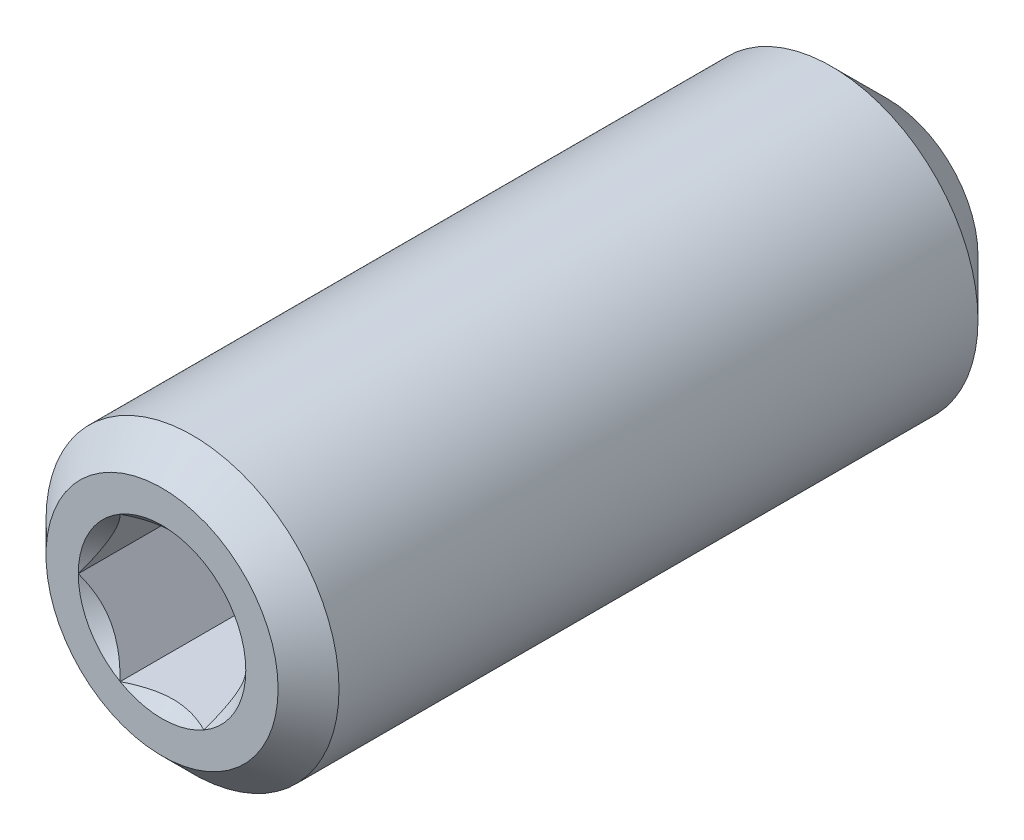
ISO-10303-21;
HEADER;
FILE_DESCRIPTION(('STEP AP214'),'2;1');
FILE_NAME('part.step','',(''),(''),'','','');
FILE_SCHEMA(('AUTOMOTIVE_DESIGN { 1 0 10303 214 1 1 1 1 }'));
ENDSEC;
DATA;
#1=APPLICATION_CONTEXT('core data for automotive mechanical design processes');
#2=APPLICATION_PROTOCOL_DEFINITION('international standard','automotive_design',2000,#1);
#3=PRODUCT_CONTEXT('',#1,'mechanical');
#4=PRODUCT('Part','Part','',(#3));
#5=PRODUCT_RELATED_PRODUCT_CATEGORY('part','',(#4));
#6=PRODUCT_DEFINITION_FORMATION('','',#4);
#7=PRODUCT_DEFINITION_CONTEXT('part definition',#1,'design');
#8=PRODUCT_DEFINITION('design','',#6,#7);
#9=PRODUCT_DEFINITION_SHAPE('','',#8);
#10=(LENGTH_UNIT() NAMED_UNIT(*) SI_UNIT(.MILLI.,.METRE.));
#11=(NAMED_UNIT(*) PLANE_ANGLE_UNIT() SI_UNIT($,.RADIAN.));
#12=(NAMED_UNIT(*) SI_UNIT($,.STERADIAN.) SOLID_ANGLE_UNIT());
#13=UNCERTAINTY_MEASURE_WITH_UNIT(LENGTH_MEASURE(1.E-05),#10,'distance_accuracy_value','');
#14=(GEOMETRIC_REPRESENTATION_CONTEXT(3) GLOBAL_UNCERTAINTY_ASSIGNED_CONTEXT((#13)) GLOBAL_UNIT_ASSIGNED_CONTEXT((#10,
#11,#12)) REPRESENTATION_CONTEXT('',''));
#15=CARTESIAN_POINT('',(0.,0.,0.));
#16=DIRECTION('',(0.,0.,1.));
#17=DIRECTION('',(1.,0.,0.));
#18=AXIS2_PLACEMENT_3D('',#15,#16,#17);
#19=CARTESIAN_POINT('',(0.,0.,-2.065741454089));
#20=DIRECTION('',(0.,0.,-1.));
#21=DIRECTION('',(1.,0.,0.));
#22=AXIS2_PLACEMENT_3D('',#19,#20,#21);
#23=SPHERICAL_SURFACE('',#22,0.57735026919);
#24=CARTESIAN_POINT('',(0.,0.,-2.620441650315));
#25=DIRECTION('',(0.,0.,1.));
#26=DIRECTION('',(1.,0.,0.));
#27=AXIS2_PLACEMENT_3D('',#24,#25,#26);
#28=CIRCLE('',#27,0.160128153805);
#29=CARTESIAN_POINT('',(0.160128153805,0.,-2.620441650315));
#30=VERTEX_POINT('',#29);
#31=EDGE_CURVE('E32',#30,#30,#28,.T.);
#32=ORIENTED_EDGE('',*,*,#31,.T.);
#33=CARTESIAN_POINT('',(0.,0.,-2.065741454089));
#34=DIRECTION('',(0.,1.,0.));
#35=DIRECTION('',(0.277350098112843,0.,-0.960768922830457));
#36=AXIS2_PLACEMENT_3D('',#33,#34,#35);
#37=CIRCLE('',#36,0.57735026919);
#38=CARTESIAN_POINT('',(0.,0.,-2.643091723279));
#39=VERTEX_POINT('',#38);
#40=EDGE_CURVE('E11',#30,#39,#37,.T.);
#41=ORIENTED_EDGE('',*,*,#40,.T.);
#42=ORIENTED_EDGE('',*,*,#40,.F.);
#43=EDGE_LOOP('',(#32,#41,#42));
#44=FACE_BOUND('',#43,.T.);
#45=ADVANCED_FACE('F17',(#44),#23,.F.);
#46=CARTESIAN_POINT('',(0.,0.,-1.333333333333));
#47=DIRECTION('',(0.,0.,1.));
#48=DIRECTION('',(1.,0.,0.));
#49=AXIS2_PLACEMENT_3D('',#46,#47,#48);
#50=CONICAL_SURFACE('',#49,2.309401076759,1.031217286681);
#51=CARTESIAN_POINT('',(1.15470053837881,-2.5685009674703E-13,-2.02483446876319));
#52=CARTESIAN_POINT('',(0.866025403783984,-0.500000000000029,-2.19770975262065));
#53=CARTESIAN_POINT('',(0.577350269189145,-0.99999999999982,-2.02483446876316));
#54=(BOUNDED_CURVE() B_SPLINE_CURVE(2,(#51,#52,#53),.UNSPECIFIED.,.F.,
.F.) B_SPLINE_CURVE_WITH_KNOTS((3,3),(0.,1.),
.UNSPECIFIED.) CURVE() GEOMETRIC_REPRESENTATION_ITEM() RATIONAL_B_SPLINE_CURVE((1.,
1.15470053837926,1.)) REPRESENTATION_ITEM(''));
#55=CARTESIAN_POINT('',(1.154700538379,0.,-2.024834468763));
#56=VERTEX_POINT('',#55);
#57=CARTESIAN_POINT('',(0.57735026919,-1.,-2.024834468763));
#58=VERTEX_POINT('',#57);
#59=EDGE_CURVE('E191',#56,#58,#54,.T.);
#60=ORIENTED_EDGE('',*,*,#59,.F.);
#61=DIRECTION('',(-0.857925035989725,0.,-0.513774885160835));
#62=VECTOR('',#61,1.);
#63=CARTESIAN_POINT('',(2.309401076759,0.,-1.333333333333));
#64=LINE('',#63,#62);
#65=EDGE_CURVE('E274',#56,#30,#64,.T.);
#66=ORIENTED_EDGE('',*,*,#65,.T.);
#67=ORIENTED_EDGE('',*,*,#31,.F.);
#68=ORIENTED_EDGE('',*,*,#65,.F.);
#69=CARTESIAN_POINT('',(0.577350269189689,0.999999999998877,-2.02483446876349));
#70=CARTESIAN_POINT('',(0.866025403784267,0.499999999999538,-2.19770975262057));
#71=CARTESIAN_POINT('',(1.15470053837902,-1.09245945623115E-13,-2.02483446876307));
#72=(BOUNDED_CURVE() B_SPLINE_CURVE(2,(#69,#70,#71),.UNSPECIFIED.,.F.,
.F.) B_SPLINE_CURVE_WITH_KNOTS((3,3),(0.,1.),
.UNSPECIFIED.) CURVE() GEOMETRIC_REPRESENTATION_ITEM() RATIONAL_B_SPLINE_CURVE((1.,
1.1547005383791,1.)) REPRESENTATION_ITEM(''));
#73=CARTESIAN_POINT('',(0.57735026919,1.,-2.024834468763));
#74=VERTEX_POINT('',#73);
#75=EDGE_CURVE('E203',#74,#56,#72,.T.);
#76=ORIENTED_EDGE('',*,*,#75,.F.);
#77=CARTESIAN_POINT('',(-0.577350269189744,1.,-2.02483446876316));
#78=CARTESIAN_POINT('',(1.28230759344206E-13,1.,-2.19770975262071));
#79=CARTESIAN_POINT('',(0.577350269190085,1.,-2.02483446876305));
#80=(BOUNDED_CURVE() B_SPLINE_CURVE(2,(#77,#78,#79),.UNSPECIFIED.,.F.,
.F.) B_SPLINE_CURVE_WITH_KNOTS((3,3),(0.,1.),
.UNSPECIFIED.) CURVE() GEOMETRIC_REPRESENTATION_ITEM() RATIONAL_B_SPLINE_CURVE((1.,
1.15470053837939,1.)) REPRESENTATION_ITEM(''));
#81=CARTESIAN_POINT('',(-0.57735026919,1.,-2.024834468763));
#82=VERTEX_POINT('',#81);
#83=EDGE_CURVE('E339',#82,#74,#80,.T.);
#84=ORIENTED_EDGE('',*,*,#83,.F.);
#85=CARTESIAN_POINT('',(-1.15470053837881,2.5685009674703E-13,-2.02483446876319));
#86=CARTESIAN_POINT('',(-0.866025403783984,0.500000000000029,-2.19770975262065));
#87=CARTESIAN_POINT('',(-0.577350269189145,0.99999999999982,-2.02483446876316));
#88=(BOUNDED_CURVE() B_SPLINE_CURVE(2,(#85,#86,#87),.UNSPECIFIED.,.F.,
.F.) B_SPLINE_CURVE_WITH_KNOTS((3,3),(0.,1.),
.UNSPECIFIED.) CURVE() GEOMETRIC_REPRESENTATION_ITEM() RATIONAL_B_SPLINE_CURVE((1.,
1.15470053837926,1.)) REPRESENTATION_ITEM(''));
#89=CARTESIAN_POINT('',(-1.154700538379,0.,-2.024834468763));
#90=VERTEX_POINT('',#89);
#91=EDGE_CURVE('E329',#90,#82,#88,.T.);
#92=ORIENTED_EDGE('',*,*,#91,.F.);
#93=CARTESIAN_POINT('',(-0.577350269189689,-0.999999999998877,-2.02483446876349));
#94=CARTESIAN_POINT('',(-0.866025403784267,-0.499999999999538,-2.19770975262057));
#95=CARTESIAN_POINT('',(-1.15470053837902,1.09245945623115E-13,-2.02483446876307));
#96=(BOUNDED_CURVE() B_SPLINE_CURVE(2,(#93,#94,#95),.UNSPECIFIED.,.F.,
.F.) B_SPLINE_CURVE_WITH_KNOTS((3,3),(0.,1.),
.UNSPECIFIED.) CURVE() GEOMETRIC_REPRESENTATION_ITEM() RATIONAL_B_SPLINE_CURVE((1.,
1.1547005383791,1.)) REPRESENTATION_ITEM(''));
#97=CARTESIAN_POINT('',(-0.57735026919,-1.,-2.024834468763));
#98=VERTEX_POINT('',#97);
#99=EDGE_CURVE('E180',#98,#90,#96,.T.);
#100=ORIENTED_EDGE('',*,*,#99,.F.);
#101=CARTESIAN_POINT('',(0.577350269189745,-1.,-2.02483446876316));
#102=CARTESIAN_POINT('',(-1.27897692436818E-13,-1.,-2.19770975262071));
#103=CARTESIAN_POINT('',(-0.577350269190086,-1.,-2.02483446876305));
#104=(BOUNDED_CURVE() B_SPLINE_CURVE(2,(#101,#102,#103),.UNSPECIFIED.,.F.,
.F.) B_SPLINE_CURVE_WITH_KNOTS((3,3),(0.,1.),
.UNSPECIFIED.) CURVE() GEOMETRIC_REPRESENTATION_ITEM() RATIONAL_B_SPLINE_CURVE((1.,
1.15470053837939,1.)) REPRESENTATION_ITEM(''));
#105=EDGE_CURVE('E181',#58,#98,#104,.T.);
#106=ORIENTED_EDGE('',*,*,#105,.F.);
#107=EDGE_LOOP('',(#60,#66,#67,#68,#76,#84,#92,#100,#106));
#108=FACE_BOUND('',#107,.T.);
#109=ADVANCED_FACE('F261',(#108),#50,.F.);
#110=CARTESIAN_POINT('',(0.,0.,-10.));
#111=DIRECTION('',(0.,0.,1.));
#112=DIRECTION('',(1.,0.,0.));
#113=AXIS2_PLACEMENT_3D('',#110,#111,#112);
#114=PLANE('',#113);
#115=CARTESIAN_POINT('',(0.,0.,-10.));
#116=DIRECTION('',(0.,0.,1.));
#117=DIRECTION('',(1.,0.,0.));
#118=AXIS2_PLACEMENT_3D('',#115,#116,#117);
#119=CIRCLE('',#118,1.25);
#120=CARTESIAN_POINT('',(1.25,0.,-10.));
#121=VERTEX_POINT('',#120);
#122=EDGE_CURVE('E292',#121,#121,#119,.T.);
#123=ORIENTED_EDGE('',*,*,#122,.F.);
#124=EDGE_LOOP('',(#123));
#125=FACE_BOUND('',#124,.T.);
#126=ADVANCED_FACE('F231',(#125),#114,.F.);
#127=CARTESIAN_POINT('',(0.57735026919,1.,0.));
#128=DIRECTION('',(0.,1.,0.));
#129=DIRECTION('',(1.,0.,0.));
#130=AXIS2_PLACEMENT_3D('',#127,#128,#129);
#131=PLANE('',#130);
#132=ORIENTED_EDGE('',*,*,#83,.T.);
#133=DIRECTION('',(0.,0.,-1.));
#134=VECTOR('',#133,1.);
#135=CARTESIAN_POINT('',(0.57735026919,1.,0.));
#136=LINE('',#135,#134);
#137=CARTESIAN_POINT('',(0.577350269189631,0.999999999999845,1.1929087428544E-13));
#138=VERTEX_POINT('',#137);
#139=EDGE_CURVE('E202',#138,#74,#136,.T.);
#140=ORIENTED_EDGE('',*,*,#139,.F.);
#141=CARTESIAN_POINT('',(-0.577350269189824,1.,3.51086559190242E-13));
#142=CARTESIAN_POINT('',(-0.537662593281324,1.,-0.019824700314592));
#143=CARTESIAN_POINT('',(-0.497311421160972,1.,-0.038484966375581));
#144=CARTESIAN_POINT('',(-0.415031239692752,1.,-0.0726511231240285));
#145=CARTESIAN_POINT('',(-0.373094409767637,1.,-0.0881380100244985));
#146=CARTESIAN_POINT('',(-0.288530684191383,1.,-0.114666959664239));
#147=CARTESIAN_POINT('',(-0.245925315342525,1.,-0.125775687448587));
#148=CARTESIAN_POINT('',(-0.159777529478818,1.,-0.142891513108807));
#149=CARTESIAN_POINT('',(-0.116237740650763,1.,-0.148911380179908));
#150=CARTESIAN_POINT('',(-0.0411908054721329,1.,-0.154341115263247));
#151=CARTESIAN_POINT('',(-0.00978111627901207,1.,-0.155143433089785));
#152=CARTESIAN_POINT('',(0.0529773243665978,1.,-0.153791220270703));
#153=CARTESIAN_POINT('',(0.0843260608264493,1.,-0.151636036465612));
#154=CARTESIAN_POINT('',(0.177924374084171,1.,-0.140876680319031));
#155=CARTESIAN_POINT('',(0.239708022946732,1.,-0.127977491807798));
#156=CARTESIAN_POINT('',(0.348099187443478,1.,-0.0968623194033932));
#157=CARTESIAN_POINT('',(0.395216894994757,1.,-0.0802830122748084));
#158=CARTESIAN_POINT('',(0.487608327593797,1.,-0.0429387150328689));
#159=CARTESIAN_POINT('',(0.532887492984382,1.,-0.02218735035632));
#160=CARTESIAN_POINT('',(0.577350269189825,1.,3.5085573117792E-13));
#161=B_SPLINE_CURVE_WITH_KNOTS('',3,(#141,#142,#143,#144,#145,#146,#147,#148,#149,#150,#151,
#152,#153,#154,#155,#156,#157,#158,#159,#160),.UNSPECIFIED.,.F.,.F.,(4,2,2,2,2,2,2,2,2,4),(0.,
0.133182946580648,0.267141541466209,0.398973326814665,0.530473323702723,0.6245964604482,
0.718740387482523,0.90708160058693,1.05673041329892,1.20589820623575),.UNSPECIFIED.);
#162=CARTESIAN_POINT('',(-0.57735026918978,0.999999999999621,0.));
#163=VERTEX_POINT('',#162);
#164=EDGE_CURVE('E204',#163,#138,#161,.T.);
#165=ORIENTED_EDGE('',*,*,#164,.F.);
#166=DIRECTION('',(0.,0.,-1.));
#167=VECTOR('',#166,1.);
#168=CARTESIAN_POINT('',(-0.57735026919,1.,0.));
#169=LINE('',#168,#167);
#170=EDGE_CURVE('E338',#163,#82,#169,.T.);
#171=ORIENTED_EDGE('',*,*,#170,.T.);
#172=EDGE_LOOP('',(#132,#140,#165,#171));
#173=FACE_BOUND('',#172,.T.);
#174=ADVANCED_FACE('F225',(#173),#131,.F.);
#175=CARTESIAN_POINT('',(-0.57735026919,1.,0.));
#176=DIRECTION('',(-0.866025403784329,0.50000000000019,0.));
#177=DIRECTION('',(0.,0.,1.));
#178=AXIS2_PLACEMENT_3D('',#175,#176,#177);
#179=PLANE('',#178);
#180=ORIENTED_EDGE('',*,*,#91,.T.);
#181=ORIENTED_EDGE('',*,*,#170,.F.);
#182=CARTESIAN_POINT('',(-1.15470053837955,6.36036362467423E-13,5.50823647627213E-13));
#183=CARTESIAN_POINT('',(-1.1348567004253,0.0343705355545384,-0.0198247003143651));
#184=CARTESIAN_POINT('',(-1.11468111436513,0.0693156756832188,-0.0384849663753273));
#185=CARTESIAN_POINT('',(-1.07354102363103,0.140572403062641,-0.072651123123723));
#186=CARTESIAN_POINT('',(-1.05257260866848,0.176890763131952,-0.0881380100241682));
#187=CARTESIAN_POINT('',(-1.01029074588036,0.250125097719591,-0.114666959663864));
#188=CARTESIAN_POINT('',(-0.988988061455934,0.287022429480281,-0.125775687448194));
#189=CARTESIAN_POINT('',(-0.94591416852409,0.361628600517979,-0.142891513108382));
#190=CARTESIAN_POINT('',(-0.924144274110068,0.399335163718456,-0.148911380179471));
#191=CARTESIAN_POINT('',(-0.886620806520746,0.464327716059292,-0.154341115262801));
#192=CARTESIAN_POINT('',(-0.870915961924174,0.491529304825515,-0.155143433089335));
#193=CARTESIAN_POINT('',(-0.839536741601345,0.545879708726526,-0.153791220270246));
#194=CARTESIAN_POINT('',(-0.823862373371407,0.573028510877308,-0.151636036465151));
#195=CARTESIAN_POINT('',(-0.777063216742511,0.654087027909888,-0.140876680318556));
#196=CARTESIAN_POINT('',(-0.746171392311207,0.707593237363376,-0.127977491807314));
#197=CARTESIAN_POINT('',(-0.691975810062893,0.801462739363186,-0.0968623194029456));
#198=CARTESIAN_POINT('',(-0.668416956287332,0.842267871070524,-0.0802830122744317));
#199=CARTESIAN_POINT('',(-0.622221239987962,0.922281198793031,-0.0429387150326629));
#200=CARTESIAN_POINT('',(-0.599581657292741,0.961494106283291,-0.0221873503562137));
#201=CARTESIAN_POINT('',(-0.577350269190088,0.999999999999848,3.50837323739064E-13));
#202=B_SPLINE_CURVE_WITH_KNOTS('',3,(#182,#183,#184,#185,#186,#187,#188,#189,#190,#191,#192,
#193,#194,#195,#196,#197,#198,#199,#200,#201),.UNSPECIFIED.,.F.,.F.,(4,2,2,2,2,2,2,2,2,4),(0.,
0.133182946580555,0.26714154146602,0.398973326814389,0.530473323702361,0.624596460447875,
0.718740387482235,0.907081600586714,1.05673041329814,1.20589820623441),.UNSPECIFIED.);
#203=CARTESIAN_POINT('',(-1.154700538379,7.9504545308362E-13,0.));
#204=VERTEX_POINT('',#203);
#205=EDGE_CURVE('E215',#204,#163,#202,.T.);
#206=ORIENTED_EDGE('',*,*,#205,.F.);
#207=DIRECTION('',(0.,0.,-1.));
#208=VECTOR('',#207,1.);
#209=CARTESIAN_POINT('',(-1.154700538379,0.,0.));
#210=LINE('',#209,#208);
#211=EDGE_CURVE('E172',#204,#90,#210,.T.);
#212=ORIENTED_EDGE('',*,*,#211,.T.);
#213=EDGE_LOOP('',(#180,#181,#206,#212));
#214=FACE_BOUND('',#213,.T.);
#215=ADVANCED_FACE('F230',(#214),#179,.F.);
#216=CARTESIAN_POINT('',(-1.154700538379,0.,0.));
#217=DIRECTION('',(-0.866025403784329,-0.50000000000019,0.));
#218=DIRECTION('',(-0.50000000000019,0.866025403784329,0.));
#219=AXIS2_PLACEMENT_3D('',#216,#217,#218);
#220=PLANE('',#219);
#221=ORIENTED_EDGE('',*,*,#99,.T.);
#222=ORIENTED_EDGE('',*,*,#211,.F.);
#223=CARTESIAN_POINT('',(-0.577350269189261,-0.999999999999689,-2.00039319897047E-13));
#224=CARTESIAN_POINT('',(-0.597194107143503,-0.965629464445796,-0.0198247003151193));
#225=CARTESIAN_POINT('',(-0.61736969320367,-0.930684324317125,-0.0384849663760853));
#226=CARTESIAN_POINT('',(-0.658509783937762,-0.859427596937721,-0.0726511231244892));
#227=CARTESIAN_POINT('',(-0.67947819890031,-0.823109236868419,-0.0881380100249389));
#228=CARTESIAN_POINT('',(-0.721760061688418,-0.749874902280797,-0.114666959664643));
#229=CARTESIAN_POINT('',(-0.743062746112836,-0.712977570520117,-0.125775687448976));
#230=CARTESIAN_POINT('',(-0.78613663904467,-0.638371399482438,-0.142891513109171));
#231=CARTESIAN_POINT('',(-0.807906533458687,-0.60066483628197,-0.148911380180263));
#232=CARTESIAN_POINT('',(-0.84543000104799,-0.535672283941165,-0.154341115263594));
#233=CARTESIAN_POINT('',(-0.861134845644551,-0.508470695174962,-0.15514343309013));
#234=CARTESIAN_POINT('',(-0.892514065967355,-0.454120291273994,-0.153791220271045));
#235=CARTESIAN_POINT('',(-0.908188434197281,-0.426971489123233,-0.151636036465954));
#236=CARTESIAN_POINT('',(-0.954987590826142,-0.345912972090714,-0.140876680319372));
#237=CARTESIAN_POINT('',(-0.985879415257422,-0.292406762637265,-0.127977491808142));
#238=CARTESIAN_POINT('',(-1.0400749975058,-0.198537260637343,-0.0968623194037414));
#239=CARTESIAN_POINT('',(-1.06363385128145,-0.15773212892986,-0.0802830122751569));
#240=CARTESIAN_POINT('',(-1.10982956758098,-0.0777188012070764,-0.0429387150332183));
#241=CARTESIAN_POINT('',(-1.13246915027627,-0.0385058937166842,-0.0221873503566702));
#242=CARTESIAN_POINT('',(-1.154700538379,0.,0.));
#243=B_SPLINE_CURVE_WITH_KNOTS('',3,(#223,#224,#225,#226,#227,#228,#229,#230,#231,#232,#233,
#234,#235,#236,#237,#238,#239,#240,#241,#242),.UNSPECIFIED.,.F.,.F.,(4,2,2,2,2,2,2,2,2,4),(0.,
0.133182946580531,0.267141541465972,0.398973326814312,0.530473323702254,0.624596460447695,
0.718740387481982,0.907081600586319,1.05673041329829,1.2058982062351),.UNSPECIFIED.);
#244=CARTESIAN_POINT('',(-0.577350269189531,-1.00000000000002,2.19286215996292E-13));
#245=VERTEX_POINT('',#244);
#246=EDGE_CURVE('E159',#245,#204,#243,.T.);
#247=ORIENTED_EDGE('',*,*,#246,.F.);
#248=DIRECTION('',(0.,0.,-1.));
#249=VECTOR('',#248,1.);
#250=CARTESIAN_POINT('',(-0.57735026919,-1.,0.));
#251=LINE('',#250,#249);
#252=EDGE_CURVE('E176',#245,#98,#251,.T.);
#253=ORIENTED_EDGE('',*,*,#252,.T.);
#254=EDGE_LOOP('',(#221,#222,#247,#253));
#255=FACE_BOUND('',#254,.T.);
#256=ADVANCED_FACE('F252',(#255),#220,.F.);
#257=CARTESIAN_POINT('',(-0.57735026919,-1.,0.));
#258=DIRECTION('',(0.,-1.,0.));
#259=DIRECTION('',(-1.,0.,0.));
#260=AXIS2_PLACEMENT_3D('',#257,#258,#259);
#261=PLANE('',#260);
#262=ORIENTED_EDGE('',*,*,#105,.T.);
#263=ORIENTED_EDGE('',*,*,#252,.F.);
#264=CARTESIAN_POINT('',(0.577350269189824,-1.,3.51398559190243E-13));
#265=CARTESIAN_POINT('',(0.537662593281324,-1.,-0.0198247003145916));
#266=CARTESIAN_POINT('',(0.497311421160971,-1.,-0.0384849663755806));
#267=CARTESIAN_POINT('',(0.415031239692751,-1.,-0.072651123124028));
#268=CARTESIAN_POINT('',(0.373094409767637,-1.,-0.088138010024498));
#269=CARTESIAN_POINT('',(0.288530684191382,-1.,-0.114666959664238));
#270=CARTESIAN_POINT('',(0.245925315342525,-1.,-0.125775687448587));
#271=CARTESIAN_POINT('',(0.159777529478817,-1.,-0.142891513108807));
#272=CARTESIAN_POINT('',(0.116237740650762,-1.,-0.148911380179907));
#273=CARTESIAN_POINT('',(0.0411908054721327,-1.,-0.154341115263247));
#274=CARTESIAN_POINT('',(0.00978111627901192,-1.,-0.155143433089784));
#275=CARTESIAN_POINT('',(-0.052977324366598,-1.,-0.153791220270703));
#276=CARTESIAN_POINT('',(-0.0843260608264494,-1.,-0.151636036465612));
#277=CARTESIAN_POINT('',(-0.177924374084171,-1.,-0.140876680319031));
#278=CARTESIAN_POINT('',(-0.239708022946732,-1.,-0.127977491807798));
#279=CARTESIAN_POINT('',(-0.348099187443478,-1.,-0.0968623194033928));
#280=CARTESIAN_POINT('',(-0.395216894994757,-1.,-0.0802830122748083));
#281=CARTESIAN_POINT('',(-0.487608327593797,-1.,-0.0429387150328689));
#282=CARTESIAN_POINT('',(-0.532887492984383,-1.,-0.0221873503563202));
#283=CARTESIAN_POINT('',(-0.577350269189825,-1.,3.50856105793705E-13));
#284=B_SPLINE_CURVE_WITH_KNOTS('',3,(#264,#265,#266,#267,#268,#269,#270,#271,#272,#273,#274,
#275,#276,#277,#278,#279,#280,#281,#282,#283),.UNSPECIFIED.,.F.,.F.,(4,2,2,2,2,2,2,2,2,4),(0.,
0.133182946580648,0.267141541466209,0.398973326814666,0.530473323702723,0.6245964604482,
0.718740387482523,0.90708160058693,1.05673041329892,1.20589820623575),.UNSPECIFIED.);
#285=CARTESIAN_POINT('',(0.57735026918978,-0.999999999999621,0.));
#286=VERTEX_POINT('',#285);
#287=EDGE_CURVE('E246',#286,#245,#284,.T.);
#288=ORIENTED_EDGE('',*,*,#287,.F.);
#289=DIRECTION('',(0.,0.,-1.));
#290=VECTOR('',#289,1.);
#291=CARTESIAN_POINT('',(0.57735026919,-1.,0.));
#292=LINE('',#291,#290);
#293=EDGE_CURVE('E187',#286,#58,#292,.T.);
#294=ORIENTED_EDGE('',*,*,#293,.T.);
#295=EDGE_LOOP('',(#262,#263,#288,#294));
#296=FACE_BOUND('',#295,.T.);
#297=ADVANCED_FACE('F257',(#296),#261,.F.);
#298=CARTESIAN_POINT('',(0.57735026919,-1.,0.));
#299=DIRECTION('',(0.866025403784329,-0.50000000000019,0.));
#300=DIRECTION('',(0.,0.,-1.));
#301=AXIS2_PLACEMENT_3D('',#298,#299,#300);
#302=PLANE('',#301);
#303=ORIENTED_EDGE('',*,*,#59,.T.);
#304=ORIENTED_EDGE('',*,*,#293,.F.);
#305=CARTESIAN_POINT('',(1.15470053837955,-6.36036362467423E-13,5.50823647627213E-13));
#306=CARTESIAN_POINT('',(1.1348567004253,-0.0343705355545384,-0.0198247003143651));
#307=CARTESIAN_POINT('',(1.11468111436513,-0.0693156756832188,-0.0384849663753273));
#308=CARTESIAN_POINT('',(1.07354102363103,-0.140572403062641,-0.072651123123723));
#309=CARTESIAN_POINT('',(1.05257260866848,-0.176890763131952,-0.0881380100241682));
#310=CARTESIAN_POINT('',(1.01029074588036,-0.250125097719591,-0.114666959663864));
#311=CARTESIAN_POINT('',(0.988988061455934,-0.287022429480281,-0.125775687448194));
#312=CARTESIAN_POINT('',(0.94591416852409,-0.361628600517979,-0.142891513108382));
#313=CARTESIAN_POINT('',(0.924144274110068,-0.399335163718456,-0.148911380179471));
#314=CARTESIAN_POINT('',(0.886620806520746,-0.464327716059292,-0.154341115262801));
#315=CARTESIAN_POINT('',(0.870915961924174,-0.491529304825515,-0.155143433089335));
#316=CARTESIAN_POINT('',(0.839536741601345,-0.545879708726526,-0.153791220270246));
#317=CARTESIAN_POINT('',(0.823862373371407,-0.573028510877308,-0.151636036465151));
#318=CARTESIAN_POINT('',(0.777063216742511,-0.654087027909888,-0.140876680318556));
#319=CARTESIAN_POINT('',(0.746171392311207,-0.707593237363376,-0.127977491807314));
#320=CARTESIAN_POINT('',(0.691975810062893,-0.801462739363186,-0.0968623194029456));
#321=CARTESIAN_POINT('',(0.668416956287332,-0.842267871070524,-0.0802830122744317));
#322=CARTESIAN_POINT('',(0.622221239987962,-0.922281198793031,-0.0429387150326629));
#323=CARTESIAN_POINT('',(0.599581657292741,-0.961494106283291,-0.0221873503562137));
#324=CARTESIAN_POINT('',(0.577350269190088,-0.999999999999848,3.50837323739064E-13));
#325=B_SPLINE_CURVE_WITH_KNOTS('',3,(#305,#306,#307,#308,#309,#310,#311,#312,#313,#314,#315,
#316,#317,#318,#319,#320,#321,#322,#323,#324),.UNSPECIFIED.,.F.,.F.,(4,2,2,2,2,2,2,2,2,4),(0.,
0.133182946580555,0.26714154146602,0.398973326814389,0.530473323702361,0.624596460447875,
0.718740387482235,0.907081600586714,1.05673041329814,1.20589820623441),.UNSPECIFIED.);
#326=CARTESIAN_POINT('',(1.154700538379,-7.94991242974996E-13,0.));
#327=VERTEX_POINT('',#326);
#328=EDGE_CURVE('E283',#327,#286,#325,.T.);
#329=ORIENTED_EDGE('',*,*,#328,.F.);
#330=DIRECTION('',(0.,0.,-1.));
#331=VECTOR('',#330,1.);
#332=CARTESIAN_POINT('',(1.154700538379,0.,0.));
#333=LINE('',#332,#331);
#334=EDGE_CURVE('E198',#327,#56,#333,.T.);
#335=ORIENTED_EDGE('',*,*,#334,.T.);
#336=EDGE_LOOP('',(#303,#304,#329,#335));
#337=FACE_BOUND('',#336,.T.);
#338=ADVANCED_FACE('F282',(#337),#302,.F.);
#339=CARTESIAN_POINT('',(1.154700538379,0.,0.));
#340=DIRECTION('',(0.866025403784329,0.50000000000019,0.));
#341=DIRECTION('',(0.,0.,-1.));
#342=AXIS2_PLACEMENT_3D('',#339,#340,#341);
#343=PLANE('',#342);
#344=ORIENTED_EDGE('',*,*,#75,.T.);
#345=ORIENTED_EDGE('',*,*,#334,.F.);
#346=CARTESIAN_POINT('',(0.577350269189262,0.999999999999689,-1.99889088437173E-13));
#347=CARTESIAN_POINT('',(0.597194107143503,0.965629464445796,-0.0198247003151192));
#348=CARTESIAN_POINT('',(0.617369693203671,0.930684324317125,-0.0384849663760852));
#349=CARTESIAN_POINT('',(0.658509783937762,0.859427596937721,-0.072651123124489));
#350=CARTESIAN_POINT('',(0.67947819890031,0.823109236868419,-0.0881380100249385));
#351=CARTESIAN_POINT('',(0.721760061688418,0.749874902280798,-0.114666959664643));
#352=CARTESIAN_POINT('',(0.743062746112837,0.712977570520117,-0.125775687448976));
#353=CARTESIAN_POINT('',(0.78613663904467,0.638371399482438,-0.142891513109171));
#354=CARTESIAN_POINT('',(0.807906533458687,0.60066483628197,-0.148911380180262));
#355=CARTESIAN_POINT('',(0.845430001047991,0.535672283941165,-0.154341115263594));
#356=CARTESIAN_POINT('',(0.861134845644551,0.508470695174962,-0.155143433090129));
#357=CARTESIAN_POINT('',(0.892514065967356,0.454120291273993,-0.153791220271045));
#358=CARTESIAN_POINT('',(0.908188434197282,0.426971489123232,-0.151636036465953));
#359=CARTESIAN_POINT('',(0.954987590826143,0.345912972090712,-0.140876680319371));
#360=CARTESIAN_POINT('',(0.985879415257424,0.292406762637264,-0.127977491808141));
#361=CARTESIAN_POINT('',(1.0400749975058,0.198537260637342,-0.0968623194037409));
#362=CARTESIAN_POINT('',(1.06363385128145,0.157732128929859,-0.0802830122751565));
#363=CARTESIAN_POINT('',(1.10982956758098,0.0777188012070758,-0.0429387150332179));
#364=CARTESIAN_POINT('',(1.13246915027627,0.0385058937166838,-0.0221873503566698));
#365=CARTESIAN_POINT('',(1.154700538379,0.,0.));
#366=B_SPLINE_CURVE_WITH_KNOTS('',3,(#346,#347,#348,#349,#350,#351,#352,#353,#354,#355,#356,
#357,#358,#359,#360,#361,#362,#363,#364,#365),.UNSPECIFIED.,.F.,.F.,(4,2,2,2,2,2,2,2,2,4),(0.,
0.133182946580531,0.267141541465972,0.398973326814311,0.530473323702253,0.624596460447695,
0.718740387481982,0.90708160058632,1.05673041329829,1.20589820623509),.UNSPECIFIED.);
#367=EDGE_CURVE('E20',#138,#327,#366,.T.);
#368=ORIENTED_EDGE('',*,*,#367,.F.);
#369=ORIENTED_EDGE('',*,*,#139,.T.);
#370=EDGE_LOOP('',(#344,#345,#368,#369));
#371=FACE_BOUND('',#370,.T.);
#372=ADVANCED_FACE('F289',(#371),#343,.F.);
#373=CARTESIAN_POINT('',(0.,0.,-9.23));
#374=DIRECTION('',(0.,0.,1.));
#375=DIRECTION('',(1.,0.,0.));
#376=AXIS2_PLACEMENT_3D('',#373,#374,#375);
#377=CONICAL_SURFACE('',#376,2.02,0.785398163397);
#378=DIRECTION('',(-0.707106781186548,0.,-0.707106781186548));
#379=VECTOR('',#378,1.);
#380=CARTESIAN_POINT('',(2.02,0.,-9.23));
#381=LINE('',#380,#379);
#382=CARTESIAN_POINT('',(2.02,0.,-9.23));
#383=VERTEX_POINT('',#382);
#384=EDGE_CURVE('E214',#383,#121,#381,.T.);
#385=ORIENTED_EDGE('',*,*,#384,.T.);
#386=ORIENTED_EDGE('',*,*,#122,.T.);
#387=ORIENTED_EDGE('',*,*,#384,.F.);
#388=CARTESIAN_POINT('',(0.,0.,-9.23));
#389=DIRECTION('',(0.,0.,1.));
#390=DIRECTION('',(1.,0.,0.));
#391=AXIS2_PLACEMENT_3D('',#388,#389,#390);
#392=CIRCLE('',#391,2.02);
#393=EDGE_CURVE('E303',#383,#383,#392,.T.);
#394=ORIENTED_EDGE('',*,*,#393,.F.);
#395=EDGE_LOOP('',(#385,#386,#387,#394));
#396=FACE_BOUND('',#395,.T.);
#397=ADVANCED_FACE('F259',(#396),#377,.T.);
#398=CARTESIAN_POINT('',(0.,0.,0.));
#399=DIRECTION('',(0.,0.,1.));
#400=DIRECTION('',(1.,0.,0.));
#401=AXIS2_PLACEMENT_3D('',#398,#399,#400);
#402=CONICAL_SURFACE('',#401,1.154700538379,0.785398163397);
#403=ORIENTED_EDGE('',*,*,#164,.T.);
#404=CARTESIAN_POINT('',(0.,0.,0.));
#405=DIRECTION('',(0.,0.,1.));
#406=DIRECTION('',(1.,0.,0.));
#407=AXIS2_PLACEMENT_3D('',#404,#405,#406);
#408=CIRCLE('',#407,1.154700538379);
#409=CARTESIAN_POINT('',(-5.06565864089831E-13,1.154700538379,0.));
#410=VERTEX_POINT('',#409);
#411=EDGE_CURVE('E361',#138,#410,#408,.T.);
#412=ORIENTED_EDGE('',*,*,#411,.T.);
#413=EDGE_CURVE('E358',#410,#163,#408,.T.);
#414=ORIENTED_EDGE('',*,*,#413,.T.);
#415=EDGE_LOOP('',(#403,#412,#414));
#416=FACE_BOUND('',#415,.T.);
#417=ADVANCED_FACE('F223',(#416),#402,.F.);
#418=CARTESIAN_POINT('',(0.,0.,0.));
#419=DIRECTION('',(0.,0.,1.));
#420=DIRECTION('',(1.,0.,0.));
#421=AXIS2_PLACEMENT_3D('',#418,#419,#420);
#422=CONICAL_SURFACE('',#421,1.154700538379,0.785398163397);
#423=ORIENTED_EDGE('',*,*,#205,.T.);
#424=CARTESIAN_POINT('',(0.,0.,0.));
#425=DIRECTION('',(0.,0.,1.));
#426=DIRECTION('',(1.,0.,0.));
#427=AXIS2_PLACEMENT_3D('',#424,#425,#426);
#428=CIRCLE('',#427,1.154700538379);
#429=CARTESIAN_POINT('',(-0.999999999999963,0.577350269189187,0.));
#430=VERTEX_POINT('',#429);
#431=EDGE_CURVE('E169',#163,#430,#428,.T.);
#432=ORIENTED_EDGE('',*,*,#431,.T.);
#433=EDGE_CURVE('E161',#430,#204,#428,.T.);
#434=ORIENTED_EDGE('',*,*,#433,.T.);
#435=EDGE_LOOP('',(#423,#432,#434));
#436=FACE_BOUND('',#435,.T.);
#437=ADVANCED_FACE('F237',(#436),#422,.F.);
#438=CARTESIAN_POINT('',(0.,0.,0.));
#439=DIRECTION('',(0.,0.,1.));
#440=DIRECTION('',(1.,0.,0.));
#441=AXIS2_PLACEMENT_3D('',#438,#439,#440);
#442=CONICAL_SURFACE('',#441,1.154700538379,0.785398163397);
#443=CARTESIAN_POINT('',(0.,0.,0.));
#444=DIRECTION('',(0.,0.,1.));
#445=DIRECTION('',(1.,0.,0.));
#446=AXIS2_PLACEMENT_3D('',#443,#444,#445);
#447=CIRCLE('',#446,1.154700538379);
#448=CARTESIAN_POINT('',(-0.999999999999701,-0.577350269189789,0.));
#449=VERTEX_POINT('',#448);
#450=EDGE_CURVE('E150',#204,#449,#447,.T.);
#451=ORIENTED_EDGE('',*,*,#450,.T.);
#452=EDGE_CURVE('E146',#449,#245,#447,.T.);
#453=ORIENTED_EDGE('',*,*,#452,.T.);
#454=ORIENTED_EDGE('',*,*,#246,.T.);
#455=EDGE_LOOP('',(#451,#453,#454));
#456=FACE_BOUND('',#455,.T.);
#457=ADVANCED_FACE('F157',(#456),#442,.F.);
#458=CARTESIAN_POINT('',(0.,0.,0.));
#459=DIRECTION('',(0.,0.,1.));
#460=DIRECTION('',(1.,0.,0.));
#461=AXIS2_PLACEMENT_3D('',#458,#459,#460);
#462=CONICAL_SURFACE('',#461,1.154700538379,0.785398163397);
#463=CARTESIAN_POINT('',(0.,0.,0.));
#464=DIRECTION('',(0.,0.,1.));
#465=DIRECTION('',(1.,0.,0.));
#466=AXIS2_PLACEMENT_3D('',#463,#464,#465);
#467=CIRCLE('',#466,1.154700538379);
#468=CARTESIAN_POINT('',(5.06424454058258E-13,-1.15470053837958,5.84896280714493E-13));
#469=VERTEX_POINT('',#468);
#470=EDGE_CURVE('E151',#245,#469,#467,.T.);
#471=ORIENTED_EDGE('',*,*,#470,.T.);
#472=EDGE_CURVE('E81',#469,#286,#467,.T.);
#473=ORIENTED_EDGE('',*,*,#472,.T.);
#474=ORIENTED_EDGE('',*,*,#287,.T.);
#475=EDGE_LOOP('',(#471,#473,#474));
#476=FACE_BOUND('',#475,.T.);
#477=ADVANCED_FACE('F233',(#476),#462,.F.);
#478=CARTESIAN_POINT('',(0.,0.,0.));
#479=DIRECTION('',(0.,0.,1.));
#480=DIRECTION('',(1.,0.,0.));
#481=AXIS2_PLACEMENT_3D('',#478,#479,#480);
#482=CONICAL_SURFACE('',#481,1.154700538379,0.785398163397);
#483=CARTESIAN_POINT('',(0.,0.,0.));
#484=DIRECTION('',(0.,0.,1.));
#485=DIRECTION('',(1.,0.,0.));
#486=AXIS2_PLACEMENT_3D('',#483,#484,#485);
#487=CIRCLE('',#486,1.154700538379);
#488=CARTESIAN_POINT('',(1.,-0.577350269189621,2.41210697249568E-13));
#489=VERTEX_POINT('',#488);
#490=EDGE_CURVE('E186',#286,#489,#487,.T.);
#491=ORIENTED_EDGE('',*,*,#490,.T.);
#492=EDGE_CURVE('E47',#489,#327,#487,.T.);
#493=ORIENTED_EDGE('',*,*,#492,.T.);
#494=ORIENTED_EDGE('',*,*,#328,.T.);
#495=EDGE_LOOP('',(#491,#493,#494));
#496=FACE_BOUND('',#495,.T.);
#497=ADVANCED_FACE('F480',(#496),#482,.F.);
#498=CARTESIAN_POINT('',(0.,0.,0.));
#499=DIRECTION('',(0.,0.,1.));
#500=DIRECTION('',(1.,0.,0.));
#501=AXIS2_PLACEMENT_3D('',#498,#499,#500);
#502=CONICAL_SURFACE('',#501,1.154700538379,0.785398163397);
#503=ORIENTED_EDGE('',*,*,#367,.T.);
#504=CARTESIAN_POINT('',(0.,0.,0.));
#505=DIRECTION('',(0.,0.,1.));
#506=DIRECTION('',(1.,0.,0.));
#507=AXIS2_PLACEMENT_3D('',#504,#505,#506);
#508=CIRCLE('',#507,1.154700538379);
#509=CARTESIAN_POINT('',(0.999999999999691,0.577350269189658,0.));
#510=VERTEX_POINT('',#509);
#511=EDGE_CURVE('E310',#327,#510,#508,.T.);
#512=ORIENTED_EDGE('',*,*,#511,.T.);
#513=EDGE_CURVE('E40',#510,#138,#508,.T.);
#514=ORIENTED_EDGE('',*,*,#513,.T.);
#515=EDGE_LOOP('',(#503,#512,#514));
#516=FACE_BOUND('',#515,.T.);
#517=ADVANCED_FACE('F484',(#516),#502,.F.);
#518=CARTESIAN_POINT('',(0.,0.,-0.42));
#519=DIRECTION('',(0.,0.,-1.));
#520=DIRECTION('',(1.,0.,0.));
#521=AXIS2_PLACEMENT_3D('',#518,#519,#520);
#522=CYLINDRICAL_SURFACE('',#521,2.02);
#523=DIRECTION('',(0.,0.,-1.));
#524=VECTOR('',#523,1.);
#525=CARTESIAN_POINT('',(2.02,0.,-0.42));
#526=LINE('',#525,#524);
#527=CARTESIAN_POINT('',(2.02,0.,-0.42));
#528=VERTEX_POINT('',#527);
#529=EDGE_CURVE('E91',#528,#383,#526,.T.);
#530=ORIENTED_EDGE('',*,*,#529,.T.);
#531=ORIENTED_EDGE('',*,*,#393,.T.);
#532=ORIENTED_EDGE('',*,*,#529,.F.);
#533=CARTESIAN_POINT('',(0.,0.,-0.42));
#534=DIRECTION('',(0.,0.,1.));
#535=DIRECTION('',(1.,0.,0.));
#536=AXIS2_PLACEMENT_3D('',#533,#534,#535);
#537=CIRCLE('',#536,2.02);
#538=EDGE_CURVE('E440',#528,#528,#537,.T.);
#539=ORIENTED_EDGE('',*,*,#538,.F.);
#540=EDGE_LOOP('',(#530,#531,#532,#539));
#541=FACE_BOUND('',#540,.T.);
#542=ADVANCED_FACE('F462',(#541),#522,.T.);
#543=CARTESIAN_POINT('',(0.,0.,0.));
#544=DIRECTION('',(0.,0.,1.));
#545=DIRECTION('',(1.,0.,0.));
#546=AXIS2_PLACEMENT_3D('',#543,#544,#545);
#547=PLANE('',#546);
#548=ORIENTED_EDGE('',*,*,#490,.F.);
#549=ORIENTED_EDGE('',*,*,#472,.F.);
#550=ORIENTED_EDGE('',*,*,#470,.F.);
#551=ORIENTED_EDGE('',*,*,#452,.F.);
#552=ORIENTED_EDGE('',*,*,#450,.F.);
#553=ORIENTED_EDGE('',*,*,#433,.F.);
#554=ORIENTED_EDGE('',*,*,#431,.F.);
#555=ORIENTED_EDGE('',*,*,#413,.F.);
#556=ORIENTED_EDGE('',*,*,#411,.F.);
#557=ORIENTED_EDGE('',*,*,#513,.F.);
#558=ORIENTED_EDGE('',*,*,#511,.F.);
#559=ORIENTED_EDGE('',*,*,#492,.F.);
#560=EDGE_LOOP('',(#548,#549,#550,#551,#552,#553,#554,#555,#556,#557,#558,#559));
#561=FACE_BOUND('',#560,.T.);
#562=CARTESIAN_POINT('',(0.,0.,0.));
#563=DIRECTION('',(0.,0.,1.));
#564=DIRECTION('',(1.,0.,0.));
#565=AXIS2_PLACEMENT_3D('',#562,#563,#564);
#566=CIRCLE('',#565,1.6);
#567=CARTESIAN_POINT('',(1.6,0.,0.));
#568=VERTEX_POINT('',#567);
#569=EDGE_CURVE('E197',#568,#568,#566,.T.);
#570=ORIENTED_EDGE('',*,*,#569,.T.);
#571=EDGE_LOOP('',(#570));
#572=FACE_BOUND('',#571,.T.);
#573=ADVANCED_FACE('F148',(#561,#572),#547,.T.);
#574=CARTESIAN_POINT('',(0.,0.,0.));
#575=DIRECTION('',(0.,0.,-1.));
#576=DIRECTION('',(1.,0.,0.));
#577=AXIS2_PLACEMENT_3D('',#574,#575,#576);
#578=CONICAL_SURFACE('',#577,1.6,0.785398163397);
#579=DIRECTION('',(0.707106781186548,0.,-0.707106781186548));
#580=VECTOR('',#579,1.);
#581=CARTESIAN_POINT('',(1.6,0.,0.));
#582=LINE('',#581,#580);
#583=EDGE_CURVE('E447',#568,#528,#582,.T.);
#584=ORIENTED_EDGE('',*,*,#583,.T.);
#585=ORIENTED_EDGE('',*,*,#538,.T.);
#586=ORIENTED_EDGE('',*,*,#583,.F.);
#587=ORIENTED_EDGE('',*,*,#569,.F.);
#588=EDGE_LOOP('',(#584,#585,#586,#587));
#589=FACE_BOUND('',#588,.T.);
#590=ADVANCED_FACE('F460',(#589),#578,.T.);
#591=CLOSED_SHELL('',(#45,#109,#126,#174,#215,#256,#297,#338,#372,#397,#417,#437,#457,#477,#497,
#517,#542,#573,#590));
#592=MANIFOLD_SOLID_BREP('B1',#591);
#593=ADVANCED_BREP_SHAPE_REPRESENTATION('',(#18,#592),#14);
#594=SHAPE_DEFINITION_REPRESENTATION(#9,#593);
ENDSEC;
END-ISO-10303-21;
